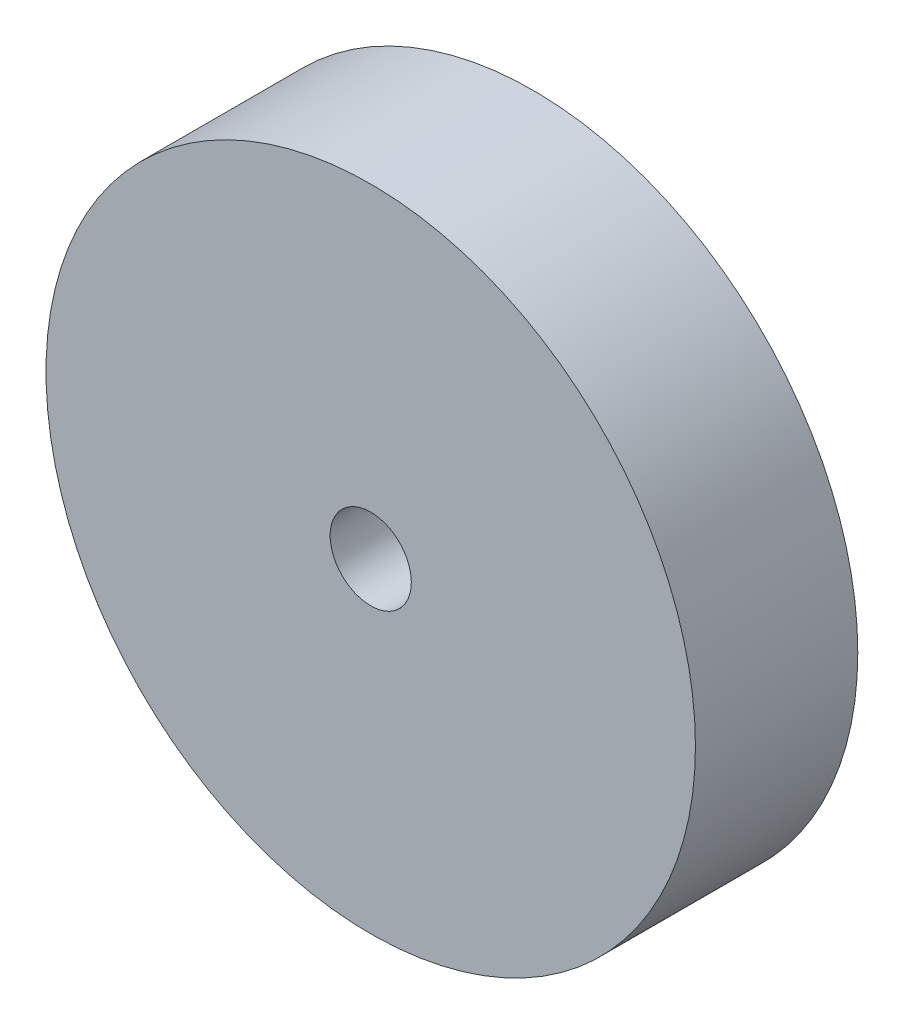
ISO-10303-21;
HEADER;
FILE_DESCRIPTION(('STEP AP214'),'2;1');
FILE_NAME('part.step','',(''),(''),'','','');
FILE_SCHEMA(('AUTOMOTIVE_DESIGN { 1 0 10303 214 1 1 1 1 }'));
ENDSEC;
DATA;
#1=APPLICATION_CONTEXT('core data for automotive mechanical design processes');
#2=APPLICATION_PROTOCOL_DEFINITION('international standard','automotive_design',2000,#1);
#3=PRODUCT_CONTEXT('',#1,'mechanical');
#4=PRODUCT('Part','Part','',(#3));
#5=PRODUCT_RELATED_PRODUCT_CATEGORY('part','',(#4));
#6=PRODUCT_DEFINITION_FORMATION('','',#4);
#7=PRODUCT_DEFINITION_CONTEXT('part definition',#1,'design');
#8=PRODUCT_DEFINITION('design','',#6,#7);
#9=PRODUCT_DEFINITION_SHAPE('','',#8);
#10=(LENGTH_UNIT() NAMED_UNIT(*) SI_UNIT(.MILLI.,.METRE.));
#11=(NAMED_UNIT(*) PLANE_ANGLE_UNIT() SI_UNIT($,.RADIAN.));
#12=(NAMED_UNIT(*) SI_UNIT($,.STERADIAN.) SOLID_ANGLE_UNIT());
#13=UNCERTAINTY_MEASURE_WITH_UNIT(LENGTH_MEASURE(1.E-05),#10,'distance_accuracy_value','');
#14=(GEOMETRIC_REPRESENTATION_CONTEXT(3) GLOBAL_UNCERTAINTY_ASSIGNED_CONTEXT((#13)) GLOBAL_UNIT_ASSIGNED_CONTEXT((#10,
#11,#12)) REPRESENTATION_CONTEXT('',''));
#15=CARTESIAN_POINT('',(0.,0.,0.));
#16=DIRECTION('',(0.,0.,1.));
#17=DIRECTION('',(1.,0.,0.));
#18=AXIS2_PLACEMENT_3D('',#15,#16,#17);
#19=CARTESIAN_POINT('',(0.,0.,2.));
#20=DIRECTION('',(0.,0.,1.));
#21=DIRECTION('',(1.,0.,0.));
#22=AXIS2_PLACEMENT_3D('',#19,#20,#21);
#23=PLANE('',#22);
#24=CARTESIAN_POINT('',(0.,0.,2.));
#25=DIRECTION('',(0.,0.,1.));
#26=DIRECTION('',(1.,0.,0.));
#27=AXIS2_PLACEMENT_3D('',#24,#25,#26);
#28=CIRCLE('',#27,4.);
#29=CARTESIAN_POINT('',(4.,0.,2.));
#30=VERTEX_POINT('',#29);
#31=EDGE_CURVE('E10',#30,#30,#28,.T.);
#32=ORIENTED_EDGE('',*,*,#31,.T.);
#33=EDGE_LOOP('',(#32));
#34=FACE_BOUND('',#33,.T.);
#35=CARTESIAN_POINT('',(0.,0.,2.));
#36=DIRECTION('',(0.,0.,1.));
#37=DIRECTION('',(1.,0.,0.));
#38=AXIS2_PLACEMENT_3D('',#35,#36,#37);
#39=CIRCLE('',#38,0.5);
#40=CARTESIAN_POINT('',(0.5,0.,2.));
#41=VERTEX_POINT('',#40);
#42=EDGE_CURVE('E50',#41,#41,#39,.T.);
#43=ORIENTED_EDGE('',*,*,#42,.F.);
#44=EDGE_LOOP('',(#43));
#45=FACE_BOUND('',#44,.T.);
#46=ADVANCED_FACE('F37',(#34,#45),#23,.T.);
#47=CARTESIAN_POINT('',(0.,0.,0.));
#48=DIRECTION('',(0.,0.,1.));
#49=DIRECTION('',(1.,0.,0.));
#50=AXIS2_PLACEMENT_3D('',#47,#48,#49);
#51=PLANE('',#50);
#52=CARTESIAN_POINT('',(0.,0.,0.));
#53=DIRECTION('',(0.,0.,1.));
#54=DIRECTION('',(1.,0.,0.));
#55=AXIS2_PLACEMENT_3D('',#52,#53,#54);
#56=CIRCLE('',#55,4.);
#57=CARTESIAN_POINT('',(4.,0.,0.));
#58=VERTEX_POINT('',#57);
#59=EDGE_CURVE('E41',#58,#58,#56,.T.);
#60=ORIENTED_EDGE('',*,*,#59,.F.);
#61=EDGE_LOOP('',(#60));
#62=FACE_BOUND('',#61,.T.);
#63=CARTESIAN_POINT('',(0.,0.,0.));
#64=DIRECTION('',(0.,0.,1.));
#65=DIRECTION('',(1.,0.,0.));
#66=AXIS2_PLACEMENT_3D('',#63,#64,#65);
#67=CIRCLE('',#66,0.5);
#68=CARTESIAN_POINT('',(0.5,0.,0.));
#69=VERTEX_POINT('',#68);
#70=EDGE_CURVE('E52',#69,#69,#67,.T.);
#71=ORIENTED_EDGE('',*,*,#70,.T.);
#72=EDGE_LOOP('',(#71));
#73=FACE_BOUND('',#72,.T.);
#74=ADVANCED_FACE('F64',(#62,#73),#51,.F.);
#75=CARTESIAN_POINT('',(0.,0.,2.));
#76=DIRECTION('',(0.,0.,-1.));
#77=DIRECTION('',(-1.,0.,0.));
#78=AXIS2_PLACEMENT_3D('',#75,#76,#77);
#79=CYLINDRICAL_SURFACE('',#78,4.);
#80=ORIENTED_EDGE('',*,*,#31,.F.);
#81=EDGE_LOOP('',(#80));
#82=FACE_BOUND('',#81,.T.);
#83=ORIENTED_EDGE('',*,*,#59,.T.);
#84=EDGE_LOOP('',(#83));
#85=FACE_BOUND('',#84,.T.);
#86=ADVANCED_FACE('F39',(#82,#85),#79,.T.);
#87=CARTESIAN_POINT('',(0.,0.,2.));
#88=DIRECTION('',(0.,0.,-1.));
#89=DIRECTION('',(-1.,0.,0.));
#90=AXIS2_PLACEMENT_3D('',#87,#88,#89);
#91=CYLINDRICAL_SURFACE('',#90,0.5);
#92=ORIENTED_EDGE('',*,*,#42,.T.);
#93=EDGE_LOOP('',(#92));
#94=FACE_BOUND('',#93,.T.);
#95=ORIENTED_EDGE('',*,*,#70,.F.);
#96=EDGE_LOOP('',(#95));
#97=FACE_BOUND('',#96,.T.);
#98=ADVANCED_FACE('F60',(#94,#97),#91,.F.);
#99=CLOSED_SHELL('',(#46,#74,#86,#98));
#100=MANIFOLD_SOLID_BREP('B2',#99);
#101=ADVANCED_BREP_SHAPE_REPRESENTATION('',(#18,#100),#14);
#102=SHAPE_DEFINITION_REPRESENTATION(#9,#101);
ENDSEC;
END-ISO-10303-21;
